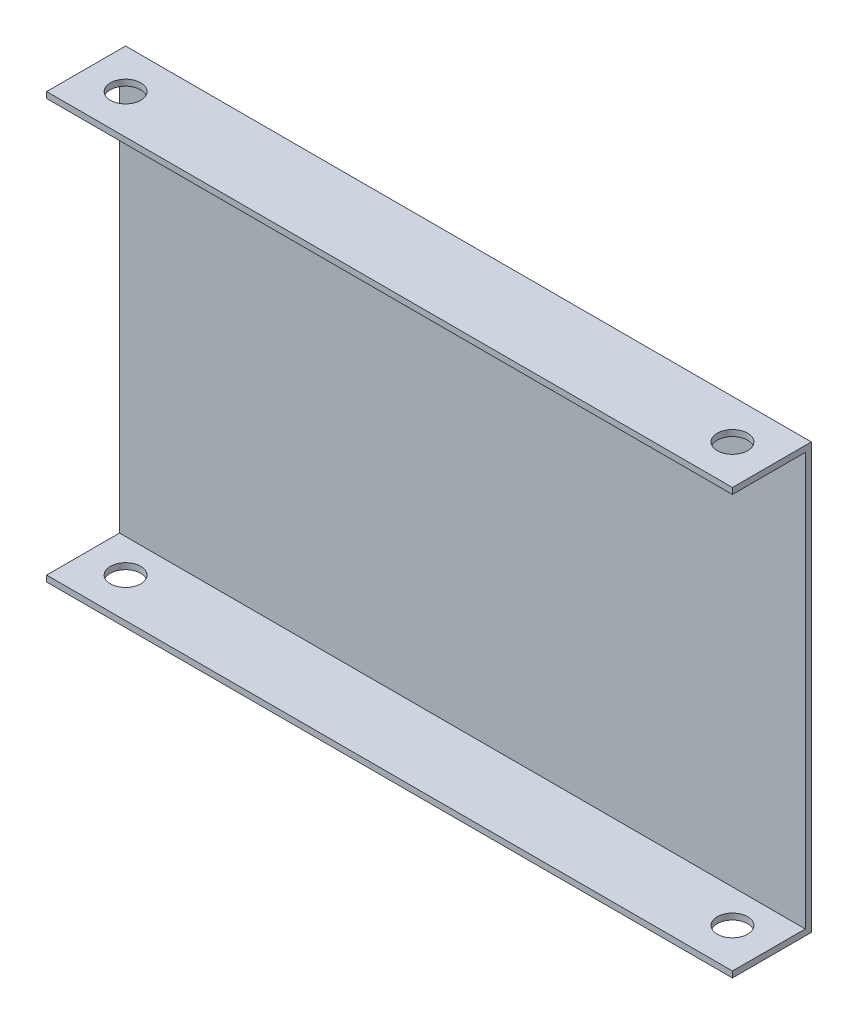
ISO-10303-21;
HEADER;
FILE_DESCRIPTION(('STEP AP214'),'2;1');
FILE_NAME('part.step','',(''),(''),'','','');
FILE_SCHEMA(('AUTOMOTIVE_DESIGN { 1 0 10303 214 1 1 1 1 }'));
ENDSEC;
DATA;
#1=APPLICATION_CONTEXT('core data for automotive mechanical design processes');
#2=APPLICATION_PROTOCOL_DEFINITION('international standard','automotive_design',2000,#1);
#3=PRODUCT_CONTEXT('',#1,'mechanical');
#4=PRODUCT('Part','Part','',(#3));
#5=PRODUCT_RELATED_PRODUCT_CATEGORY('part','',(#4));
#6=PRODUCT_DEFINITION_FORMATION('','',#4);
#7=PRODUCT_DEFINITION_CONTEXT('part definition',#1,'design');
#8=PRODUCT_DEFINITION('design','',#6,#7);
#9=PRODUCT_DEFINITION_SHAPE('','',#8);
#10=(LENGTH_UNIT() NAMED_UNIT(*) SI_UNIT(.MILLI.,.METRE.));
#11=(NAMED_UNIT(*) PLANE_ANGLE_UNIT() SI_UNIT($,.RADIAN.));
#12=(NAMED_UNIT(*) SI_UNIT($,.STERADIAN.) SOLID_ANGLE_UNIT());
#13=UNCERTAINTY_MEASURE_WITH_UNIT(LENGTH_MEASURE(1.E-05),#10,'distance_accuracy_value','');
#14=(GEOMETRIC_REPRESENTATION_CONTEXT(3) GLOBAL_UNCERTAINTY_ASSIGNED_CONTEXT((#13)) GLOBAL_UNIT_ASSIGNED_CONTEXT((#10,
#11,#12)) REPRESENTATION_CONTEXT('',''));
#15=CARTESIAN_POINT('',(0.,0.,0.));
#16=DIRECTION('',(0.,0.,1.));
#17=DIRECTION('',(1.,0.,0.));
#18=AXIS2_PLACEMENT_3D('',#15,#16,#17);
#19=CARTESIAN_POINT('',(0.,0.,33.02));
#20=DIRECTION('',(0.,0.,-1.));
#21=DIRECTION('',(-1.,0.,0.));
#22=AXIS2_PLACEMENT_3D('',#19,#20,#21);
#23=PLANE('',#22);
#24=DIRECTION('',(0.,-1.,0.));
#25=VECTOR('',#24,1.);
#26=CARTESIAN_POINT('',(-143.51,-88.9,33.02));
#27=LINE('',#26,#25);
#28=CARTESIAN_POINT('',(-143.51,88.9,33.02));
#29=VERTEX_POINT('',#28);
#30=CARTESIAN_POINT('',(-143.51,86.36,33.02));
#31=VERTEX_POINT('',#30);
#32=EDGE_CURVE('E131',#29,#31,#27,.T.);
#33=ORIENTED_EDGE('',*,*,#32,.T.);
#34=DIRECTION('',(-1.,0.,0.));
#35=VECTOR('',#34,1.);
#36=CARTESIAN_POINT('',(140.97,86.36,33.02));
#37=LINE('',#36,#35);
#38=CARTESIAN_POINT('',(143.51,86.36,33.02));
#39=VERTEX_POINT('',#38);
#40=EDGE_CURVE('E128',#39,#31,#37,.T.);
#41=ORIENTED_EDGE('',*,*,#40,.F.);
#42=DIRECTION('',(0.,1.,0.));
#43=VECTOR('',#42,1.);
#44=CARTESIAN_POINT('',(143.51,-88.9,33.02));
#45=LINE('',#44,#43);
#46=CARTESIAN_POINT('',(143.51,88.9,33.02));
#47=VERTEX_POINT('',#46);
#48=EDGE_CURVE('E103',#39,#47,#45,.T.);
#49=ORIENTED_EDGE('',*,*,#48,.T.);
#50=DIRECTION('',(-1.,0.,0.));
#51=VECTOR('',#50,1.);
#52=CARTESIAN_POINT('',(-143.51,88.9,33.02));
#53=LINE('',#52,#51);
#54=EDGE_CURVE('E158',#47,#29,#53,.T.);
#55=ORIENTED_EDGE('',*,*,#54,.T.);
#56=EDGE_LOOP('',(#33,#41,#49,#55));
#57=FACE_BOUND('',#56,.T.);
#58=ADVANCED_FACE('F51',(#57),#23,.F.);
#59=CARTESIAN_POINT('',(143.51,-88.9,33.02));
#60=DIRECTION('',(-1.,0.,0.));
#61=DIRECTION('',(0.,0.,1.));
#62=AXIS2_PLACEMENT_3D('',#59,#60,#61);
#63=PLANE('',#62);
#64=ORIENTED_EDGE('',*,*,#48,.F.);
#65=DIRECTION('',(0.,0.,1.));
#66=VECTOR('',#65,1.);
#67=CARTESIAN_POINT('',(143.51,86.36,2.54));
#68=LINE('',#67,#66);
#69=CARTESIAN_POINT('',(143.51,86.36,2.54));
#70=VERTEX_POINT('',#69);
#71=EDGE_CURVE('E140',#70,#39,#68,.T.);
#72=ORIENTED_EDGE('',*,*,#71,.F.);
#73=DIRECTION('',(0.,1.,0.));
#74=VECTOR('',#73,1.);
#75=CARTESIAN_POINT('',(143.51,-86.36,2.54));
#76=LINE('',#75,#74);
#77=CARTESIAN_POINT('',(143.51,-86.36,2.54));
#78=VERTEX_POINT('',#77);
#79=EDGE_CURVE('E220',#78,#70,#76,.T.);
#80=ORIENTED_EDGE('',*,*,#79,.F.);
#81=DIRECTION('',(0.,0.,-1.));
#82=VECTOR('',#81,1.);
#83=CARTESIAN_POINT('',(143.51,-86.36,33.02));
#84=LINE('',#83,#82);
#85=CARTESIAN_POINT('',(143.51,-86.36,33.02));
#86=VERTEX_POINT('',#85);
#87=EDGE_CURVE('E147',#86,#78,#84,.T.);
#88=ORIENTED_EDGE('',*,*,#87,.F.);
#89=CARTESIAN_POINT('',(143.51,-88.9,33.02));
#90=VERTEX_POINT('',#89);
#91=EDGE_CURVE('E153',#90,#86,#45,.T.);
#92=ORIENTED_EDGE('',*,*,#91,.F.);
#93=DIRECTION('',(0.,0.,-1.));
#94=VECTOR('',#93,1.);
#95=CARTESIAN_POINT('',(143.51,-88.9,33.02));
#96=LINE('',#95,#94);
#97=CARTESIAN_POINT('',(143.51,-88.9,0.));
#98=VERTEX_POINT('',#97);
#99=EDGE_CURVE('E169',#90,#98,#96,.T.);
#100=ORIENTED_EDGE('',*,*,#99,.T.);
#101=DIRECTION('',(0.,1.,0.));
#102=VECTOR('',#101,1.);
#103=CARTESIAN_POINT('',(143.51,-88.9,0.));
#104=LINE('',#103,#102);
#105=CARTESIAN_POINT('',(143.51,88.9,0.));
#106=VERTEX_POINT('',#105);
#107=EDGE_CURVE('E170',#98,#106,#104,.T.);
#108=ORIENTED_EDGE('',*,*,#107,.T.);
#109=DIRECTION('',(0.,0.,-1.));
#110=VECTOR('',#109,1.);
#111=CARTESIAN_POINT('',(143.51,88.9,33.02));
#112=LINE('',#111,#110);
#113=EDGE_CURVE('E11',#47,#106,#112,.T.);
#114=ORIENTED_EDGE('',*,*,#113,.F.);
#115=EDGE_LOOP('',(#64,#72,#80,#88,#92,#100,#108,#114));
#116=FACE_BOUND('',#115,.T.);
#117=ADVANCED_FACE('F53',(#116),#63,.F.);
#118=CARTESIAN_POINT('',(-143.51,88.9,33.02));
#119=DIRECTION('',(0.,-1.,0.));
#120=DIRECTION('',(0.,0.,-1.));
#121=AXIS2_PLACEMENT_3D('',#118,#119,#120);
#122=PLANE('',#121);
#123=CARTESIAN_POINT('',(127.,88.9,16.51));
#124=DIRECTION('',(0.,1.,0.));
#125=DIRECTION('',(0.,0.,1.));
#126=AXIS2_PLACEMENT_3D('',#123,#124,#125);
#127=CIRCLE('',#126,6.35);
#128=CARTESIAN_POINT('',(127.,88.9,22.86));
#129=VERTEX_POINT('',#128);
#130=EDGE_CURVE('E197',#129,#129,#127,.T.);
#131=ORIENTED_EDGE('',*,*,#130,.F.);
#132=EDGE_LOOP('',(#131));
#133=FACE_BOUND('',#132,.T.);
#134=CARTESIAN_POINT('',(-127.,88.9,16.51));
#135=DIRECTION('',(0.,1.,0.));
#136=DIRECTION('',(0.,0.,1.));
#137=AXIS2_PLACEMENT_3D('',#134,#135,#136);
#138=CIRCLE('',#137,6.35);
#139=CARTESIAN_POINT('',(-127.,88.9,22.86));
#140=VERTEX_POINT('',#139);
#141=EDGE_CURVE('E204',#140,#140,#138,.T.);
#142=ORIENTED_EDGE('',*,*,#141,.F.);
#143=EDGE_LOOP('',(#142));
#144=FACE_BOUND('',#143,.T.);
#145=DIRECTION('',(-1.,0.,0.));
#146=VECTOR('',#145,1.);
#147=CARTESIAN_POINT('',(-143.51,88.9,0.));
#148=LINE('',#147,#146);
#149=CARTESIAN_POINT('',(-143.51,88.9,0.));
#150=VERTEX_POINT('',#149);
#151=EDGE_CURVE('E173',#106,#150,#148,.T.);
#152=ORIENTED_EDGE('',*,*,#151,.T.);
#153=DIRECTION('',(0.,0.,-1.));
#154=VECTOR('',#153,1.);
#155=CARTESIAN_POINT('',(-143.51,88.9,33.02));
#156=LINE('',#155,#154);
#157=EDGE_CURVE('E62',#29,#150,#156,.T.);
#158=ORIENTED_EDGE('',*,*,#157,.F.);
#159=ORIENTED_EDGE('',*,*,#54,.F.);
#160=ORIENTED_EDGE('',*,*,#113,.T.);
#161=EDGE_LOOP('',(#152,#158,#159,#160));
#162=FACE_BOUND('',#161,.T.);
#163=ADVANCED_FACE('F263',(#133,#144,#162),#122,.F.);
#164=CARTESIAN_POINT('',(-143.51,-88.9,33.02));
#165=DIRECTION('',(1.,0.,0.));
#166=DIRECTION('',(0.,0.,-1.));
#167=AXIS2_PLACEMENT_3D('',#164,#165,#166);
#168=PLANE('',#167);
#169=DIRECTION('',(0.,1.,0.));
#170=VECTOR('',#169,1.);
#171=CARTESIAN_POINT('',(-143.51,-86.36,2.54));
#172=LINE('',#171,#170);
#173=CARTESIAN_POINT('',(-143.51,-86.36,2.54));
#174=VERTEX_POINT('',#173);
#175=CARTESIAN_POINT('',(-143.51,86.36,2.54));
#176=VERTEX_POINT('',#175);
#177=EDGE_CURVE('E230',#174,#176,#172,.T.);
#178=ORIENTED_EDGE('',*,*,#177,.T.);
#179=DIRECTION('',(0.,0.,1.));
#180=VECTOR('',#179,1.);
#181=CARTESIAN_POINT('',(-143.51,86.36,2.54));
#182=LINE('',#181,#180);
#183=EDGE_CURVE('E223',#176,#31,#182,.T.);
#184=ORIENTED_EDGE('',*,*,#183,.T.);
#185=ORIENTED_EDGE('',*,*,#32,.F.);
#186=ORIENTED_EDGE('',*,*,#157,.T.);
#187=DIRECTION('',(0.,-1.,0.));
#188=VECTOR('',#187,1.);
#189=CARTESIAN_POINT('',(-143.51,-88.9,0.));
#190=LINE('',#189,#188);
#191=CARTESIAN_POINT('',(-143.51,-88.9,0.));
#192=VERTEX_POINT('',#191);
#193=EDGE_CURVE('E89',#150,#192,#190,.T.);
#194=ORIENTED_EDGE('',*,*,#193,.T.);
#195=DIRECTION('',(0.,0.,-1.));
#196=VECTOR('',#195,1.);
#197=CARTESIAN_POINT('',(-143.51,-88.9,33.02));
#198=LINE('',#197,#196);
#199=CARTESIAN_POINT('',(-143.51,-88.9,33.02));
#200=VERTEX_POINT('',#199);
#201=EDGE_CURVE('E180',#200,#192,#198,.T.);
#202=ORIENTED_EDGE('',*,*,#201,.F.);
#203=CARTESIAN_POINT('',(-143.51,-86.36,33.02));
#204=VERTEX_POINT('',#203);
#205=EDGE_CURVE('E164',#204,#200,#27,.T.);
#206=ORIENTED_EDGE('',*,*,#205,.F.);
#207=DIRECTION('',(0.,0.,-1.));
#208=VECTOR('',#207,1.);
#209=CARTESIAN_POINT('',(-143.51,-86.36,33.02));
#210=LINE('',#209,#208);
#211=EDGE_CURVE('E226',#204,#174,#210,.T.);
#212=ORIENTED_EDGE('',*,*,#211,.T.);
#213=EDGE_LOOP('',(#178,#184,#185,#186,#194,#202,#206,#212));
#214=FACE_BOUND('',#213,.T.);
#215=ADVANCED_FACE('F256',(#214),#168,.F.);
#216=CARTESIAN_POINT('',(-143.51,-88.9,33.02));
#217=DIRECTION('',(0.,1.,0.));
#218=DIRECTION('',(0.,0.,1.));
#219=AXIS2_PLACEMENT_3D('',#216,#217,#218);
#220=PLANE('',#219);
#221=CARTESIAN_POINT('',(127.,-88.9,16.51));
#222=DIRECTION('',(0.,1.,0.));
#223=DIRECTION('',(0.,0.,1.));
#224=AXIS2_PLACEMENT_3D('',#221,#222,#223);
#225=CIRCLE('',#224,6.35);
#226=CARTESIAN_POINT('',(127.,-88.9,22.86));
#227=VERTEX_POINT('',#226);
#228=EDGE_CURVE('E188',#227,#227,#225,.T.);
#229=ORIENTED_EDGE('',*,*,#228,.T.);
#230=EDGE_LOOP('',(#229));
#231=FACE_BOUND('',#230,.T.);
#232=CARTESIAN_POINT('',(-127.,-88.9,16.51));
#233=DIRECTION('',(0.,1.,0.));
#234=DIRECTION('',(0.,0.,1.));
#235=AXIS2_PLACEMENT_3D('',#232,#233,#234);
#236=CIRCLE('',#235,6.35);
#237=CARTESIAN_POINT('',(-127.,-88.9,22.86));
#238=VERTEX_POINT('',#237);
#239=EDGE_CURVE('E207',#238,#238,#236,.T.);
#240=ORIENTED_EDGE('',*,*,#239,.T.);
#241=EDGE_LOOP('',(#240));
#242=FACE_BOUND('',#241,.T.);
#243=DIRECTION('',(1.,0.,0.));
#244=VECTOR('',#243,1.);
#245=CARTESIAN_POINT('',(-143.51,-88.9,0.));
#246=LINE('',#245,#244);
#247=EDGE_CURVE('E95',#192,#98,#246,.T.);
#248=ORIENTED_EDGE('',*,*,#247,.T.);
#249=ORIENTED_EDGE('',*,*,#99,.F.);
#250=DIRECTION('',(1.,0.,0.));
#251=VECTOR('',#250,1.);
#252=CARTESIAN_POINT('',(-143.51,-88.9,33.02));
#253=LINE('',#252,#251);
#254=EDGE_CURVE('E71',#200,#90,#253,.T.);
#255=ORIENTED_EDGE('',*,*,#254,.F.);
#256=ORIENTED_EDGE('',*,*,#201,.T.);
#257=EDGE_LOOP('',(#248,#249,#255,#256));
#258=FACE_BOUND('',#257,.T.);
#259=ADVANCED_FACE('F248',(#231,#242,#258),#220,.F.);
#260=ORIENTED_EDGE('',*,*,#91,.T.);
#261=DIRECTION('',(1.,0.,0.));
#262=VECTOR('',#261,1.);
#263=CARTESIAN_POINT('',(-140.97,-86.36,33.02));
#264=LINE('',#263,#262);
#265=EDGE_CURVE('E137',#204,#86,#264,.T.);
#266=ORIENTED_EDGE('',*,*,#265,.F.);
#267=ORIENTED_EDGE('',*,*,#205,.T.);
#268=ORIENTED_EDGE('',*,*,#254,.T.);
#269=EDGE_LOOP('',(#260,#266,#267,#268));
#270=FACE_BOUND('',#269,.T.);
#271=ADVANCED_FACE('F245',(#270),#23,.F.);
#272=CARTESIAN_POINT('',(0.,0.,0.));
#273=DIRECTION('',(0.,0.,-1.));
#274=DIRECTION('',(-1.,0.,0.));
#275=AXIS2_PLACEMENT_3D('',#272,#273,#274);
#276=PLANE('',#275);
#277=ORIENTED_EDGE('',*,*,#107,.F.);
#278=ORIENTED_EDGE('',*,*,#247,.F.);
#279=ORIENTED_EDGE('',*,*,#193,.F.);
#280=ORIENTED_EDGE('',*,*,#151,.F.);
#281=EDGE_LOOP('',(#277,#278,#279,#280));
#282=FACE_BOUND('',#281,.T.);
#283=ADVANCED_FACE('F247',(#282),#276,.T.);
#284=CARTESIAN_POINT('',(-140.97,-86.36,2.54));
#285=DIRECTION('',(0.,-1.,0.));
#286=DIRECTION('',(0.,0.,-1.));
#287=AXIS2_PLACEMENT_3D('',#284,#285,#286);
#288=PLANE('',#287);
#289=CARTESIAN_POINT('',(127.,-86.36,16.51));
#290=DIRECTION('',(0.,-1.,0.));
#291=DIRECTION('',(0.,0.,-1.));
#292=AXIS2_PLACEMENT_3D('',#289,#290,#291);
#293=CIRCLE('',#292,6.35);
#294=CARTESIAN_POINT('',(127.,-86.36,10.16));
#295=VERTEX_POINT('',#294);
#296=EDGE_CURVE('E148',#295,#295,#293,.T.);
#297=ORIENTED_EDGE('',*,*,#296,.T.);
#298=EDGE_LOOP('',(#297));
#299=FACE_BOUND('',#298,.T.);
#300=CARTESIAN_POINT('',(-127.,-86.36,16.51));
#301=DIRECTION('',(0.,-1.,0.));
#302=DIRECTION('',(0.,0.,-1.));
#303=AXIS2_PLACEMENT_3D('',#300,#301,#302);
#304=CIRCLE('',#303,6.35);
#305=CARTESIAN_POINT('',(-127.,-86.36,10.16));
#306=VERTEX_POINT('',#305);
#307=EDGE_CURVE('E187',#306,#306,#304,.T.);
#308=ORIENTED_EDGE('',*,*,#307,.T.);
#309=EDGE_LOOP('',(#308));
#310=FACE_BOUND('',#309,.T.);
#311=ORIENTED_EDGE('',*,*,#265,.T.);
#312=ORIENTED_EDGE('',*,*,#87,.T.);
#313=DIRECTION('',(1.,0.,0.));
#314=VECTOR('',#313,1.);
#315=CARTESIAN_POINT('',(-140.97,-86.36,2.54));
#316=LINE('',#315,#314);
#317=EDGE_CURVE('E136',#174,#78,#316,.T.);
#318=ORIENTED_EDGE('',*,*,#317,.F.);
#319=ORIENTED_EDGE('',*,*,#211,.F.);
#320=EDGE_LOOP('',(#311,#312,#318,#319));
#321=FACE_BOUND('',#320,.T.);
#322=ADVANCED_FACE('F242',(#299,#310,#321),#288,.F.);
#323=CARTESIAN_POINT('',(140.97,86.36,2.54));
#324=DIRECTION('',(0.,1.,0.));
#325=DIRECTION('',(0.,0.,1.));
#326=AXIS2_PLACEMENT_3D('',#323,#324,#325);
#327=PLANE('',#326);
#328=CARTESIAN_POINT('',(127.,86.36,16.51));
#329=DIRECTION('',(0.,1.,0.));
#330=DIRECTION('',(0.,0.,1.));
#331=AXIS2_PLACEMENT_3D('',#328,#329,#330);
#332=CIRCLE('',#331,6.35);
#333=CARTESIAN_POINT('',(127.,86.36,22.86));
#334=VERTEX_POINT('',#333);
#335=EDGE_CURVE('E55',#334,#334,#332,.T.);
#336=ORIENTED_EDGE('',*,*,#335,.T.);
#337=EDGE_LOOP('',(#336));
#338=FACE_BOUND('',#337,.T.);
#339=CARTESIAN_POINT('',(-127.,86.36,16.51));
#340=DIRECTION('',(0.,1.,0.));
#341=DIRECTION('',(0.,0.,1.));
#342=AXIS2_PLACEMENT_3D('',#339,#340,#341);
#343=CIRCLE('',#342,6.35);
#344=CARTESIAN_POINT('',(-127.,86.36,22.86));
#345=VERTEX_POINT('',#344);
#346=EDGE_CURVE('E184',#345,#345,#343,.T.);
#347=ORIENTED_EDGE('',*,*,#346,.T.);
#348=EDGE_LOOP('',(#347));
#349=FACE_BOUND('',#348,.T.);
#350=ORIENTED_EDGE('',*,*,#40,.T.);
#351=ORIENTED_EDGE('',*,*,#183,.F.);
#352=DIRECTION('',(-1.,0.,0.));
#353=VECTOR('',#352,1.);
#354=CARTESIAN_POINT('',(140.97,86.36,2.54));
#355=LINE('',#354,#353);
#356=EDGE_CURVE('E142',#70,#176,#355,.T.);
#357=ORIENTED_EDGE('',*,*,#356,.F.);
#358=ORIENTED_EDGE('',*,*,#71,.T.);
#359=EDGE_LOOP('',(#350,#351,#357,#358));
#360=FACE_BOUND('',#359,.T.);
#361=ADVANCED_FACE('F141',(#338,#349,#360),#327,.F.);
#362=CARTESIAN_POINT('',(0.,0.,2.54));
#363=DIRECTION('',(0.,0.,1.));
#364=DIRECTION('',(1.,0.,0.));
#365=AXIS2_PLACEMENT_3D('',#362,#363,#364);
#366=PLANE('',#365);
#367=ORIENTED_EDGE('',*,*,#317,.T.);
#368=ORIENTED_EDGE('',*,*,#79,.T.);
#369=ORIENTED_EDGE('',*,*,#356,.T.);
#370=ORIENTED_EDGE('',*,*,#177,.F.);
#371=EDGE_LOOP('',(#367,#368,#369,#370));
#372=FACE_BOUND('',#371,.T.);
#373=ADVANCED_FACE('F346',(#372),#366,.T.);
#374=CARTESIAN_POINT('',(-127.,-88.9,16.51));
#375=DIRECTION('',(0.,1.,0.));
#376=DIRECTION('',(0.,0.,1.));
#377=AXIS2_PLACEMENT_3D('',#374,#375,#376);
#378=CYLINDRICAL_SURFACE('',#377,6.35);
#379=ORIENTED_EDGE('',*,*,#141,.T.);
#380=EDGE_LOOP('',(#379));
#381=FACE_BOUND('',#380,.T.);
#382=ORIENTED_EDGE('',*,*,#346,.F.);
#383=EDGE_LOOP('',(#382));
#384=FACE_BOUND('',#383,.T.);
#385=ADVANCED_FACE('F336',(#381,#384),#378,.F.);
#386=CARTESIAN_POINT('',(127.,-88.9,16.51));
#387=DIRECTION('',(0.,1.,0.));
#388=DIRECTION('',(0.,0.,1.));
#389=AXIS2_PLACEMENT_3D('',#386,#387,#388);
#390=CYLINDRICAL_SURFACE('',#389,6.35);
#391=ORIENTED_EDGE('',*,*,#130,.T.);
#392=EDGE_LOOP('',(#391));
#393=FACE_BOUND('',#392,.T.);
#394=ORIENTED_EDGE('',*,*,#335,.F.);
#395=EDGE_LOOP('',(#394));
#396=FACE_BOUND('',#395,.T.);
#397=ADVANCED_FACE('F333',(#393,#396),#390,.F.);
#398=ORIENTED_EDGE('',*,*,#239,.F.);
#399=EDGE_LOOP('',(#398));
#400=FACE_BOUND('',#399,.T.);
#401=ORIENTED_EDGE('',*,*,#307,.F.);
#402=EDGE_LOOP('',(#401));
#403=FACE_BOUND('',#402,.T.);
#404=ADVANCED_FACE('F335',(#400,#403),#378,.F.);
#405=ORIENTED_EDGE('',*,*,#228,.F.);
#406=EDGE_LOOP('',(#405));
#407=FACE_BOUND('',#406,.T.);
#408=ORIENTED_EDGE('',*,*,#296,.F.);
#409=EDGE_LOOP('',(#408));
#410=FACE_BOUND('',#409,.T.);
#411=ADVANCED_FACE('F339',(#407,#410),#390,.F.);
#412=CLOSED_SHELL('',(#58,#117,#163,#215,#259,#271,#283,#322,#361,#373,#385,#397,#404,#411));
#413=MANIFOLD_SOLID_BREP('B2',#412);
#414=ADVANCED_BREP_SHAPE_REPRESENTATION('',(#18,#413),#14);
#415=SHAPE_DEFINITION_REPRESENTATION(#9,#414);
ENDSEC;
END-ISO-10303-21;
